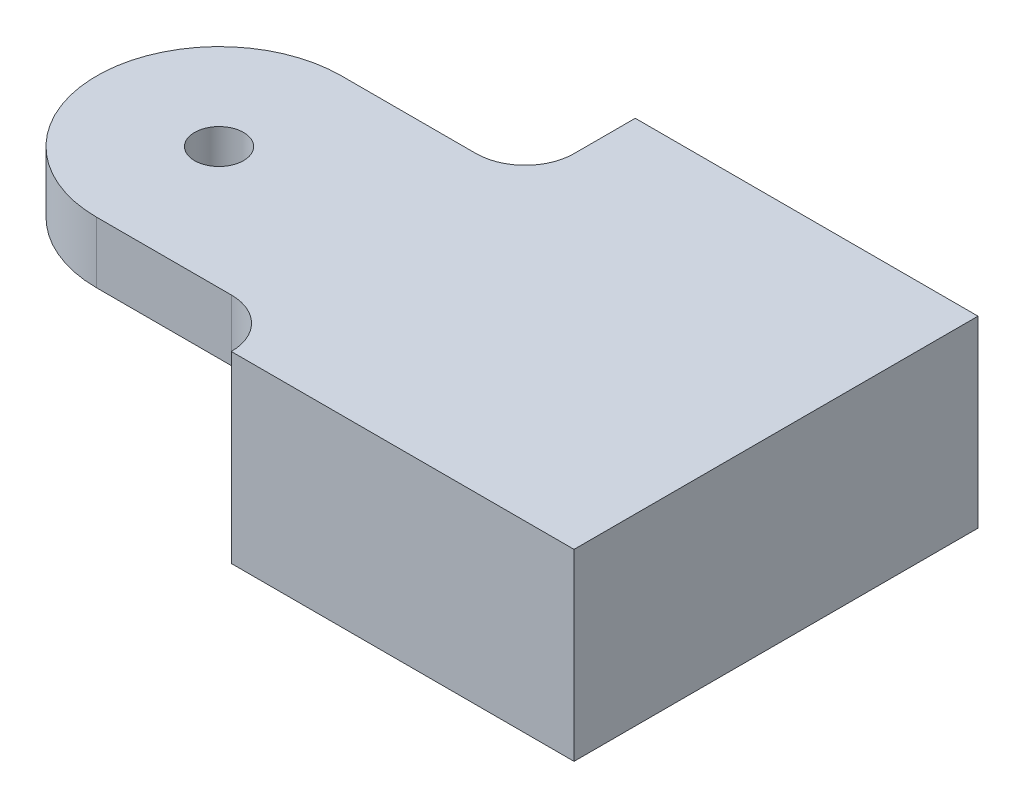
ISO-10303-21;
HEADER;
FILE_DESCRIPTION(('STEP AP214'),'2;1');
FILE_NAME('part.step','',(''),(''),'','','');
FILE_SCHEMA(('AUTOMOTIVE_DESIGN { 1 0 10303 214 1 1 1 1 }'));
ENDSEC;
DATA;
#1=APPLICATION_CONTEXT('core data for automotive mechanical design processes');
#2=APPLICATION_PROTOCOL_DEFINITION('international standard','automotive_design',2000,#1);
#3=PRODUCT_CONTEXT('',#1,'mechanical');
#4=PRODUCT('Part','Part','',(#3));
#5=PRODUCT_RELATED_PRODUCT_CATEGORY('part','',(#4));
#6=PRODUCT_DEFINITION_FORMATION('','',#4);
#7=PRODUCT_DEFINITION_CONTEXT('part definition',#1,'design');
#8=PRODUCT_DEFINITION('design','',#6,#7);
#9=PRODUCT_DEFINITION_SHAPE('','',#8);
#10=(LENGTH_UNIT() NAMED_UNIT(*) SI_UNIT(.MILLI.,.METRE.));
#11=(NAMED_UNIT(*) PLANE_ANGLE_UNIT() SI_UNIT($,.RADIAN.));
#12=(NAMED_UNIT(*) SI_UNIT($,.STERADIAN.) SOLID_ANGLE_UNIT());
#13=UNCERTAINTY_MEASURE_WITH_UNIT(LENGTH_MEASURE(1.E-05),#10,'distance_accuracy_value','');
#14=(GEOMETRIC_REPRESENTATION_CONTEXT(3) GLOBAL_UNCERTAINTY_ASSIGNED_CONTEXT((#13)) GLOBAL_UNIT_ASSIGNED_CONTEXT((#10,
#11,#12)) REPRESENTATION_CONTEXT('',''));
#15=CARTESIAN_POINT('',(0.,0.,0.));
#16=DIRECTION('',(0.,0.,1.));
#17=DIRECTION('',(1.,0.,0.));
#18=AXIS2_PLACEMENT_3D('',#15,#16,#17);
#19=CARTESIAN_POINT('',(0.,0.,0.));
#20=DIRECTION('',(0.,1.,0.));
#21=DIRECTION('',(0.,0.,1.));
#22=AXIS2_PLACEMENT_3D('',#19,#20,#21);
#23=PLANE('',#22);
#24=CARTESIAN_POINT('',(-43.,0.,-14.));
#25=DIRECTION('',(0.,1.,0.));
#26=DIRECTION('',(0.,0.,1.));
#27=AXIS2_PLACEMENT_3D('',#24,#25,#26);
#28=CIRCLE('',#27,2.);
#29=CARTESIAN_POINT('',(-43.,0.,-12.));
#30=VERTEX_POINT('',#29);
#31=EDGE_CURVE('E147',#30,#30,#28,.T.);
#32=ORIENTED_EDGE('',*,*,#31,.T.);
#33=EDGE_LOOP('',(#32));
#34=FACE_BOUND('',#33,.T.);
#35=DIRECTION('',(0.,0.,-1.));
#36=VECTOR('',#35,1.);
#37=CARTESIAN_POINT('',(-28.,0.,-33.));
#38=LINE('',#37,#36);
#39=CARTESIAN_POINT('',(-28.,0.,0.));
#40=VERTEX_POINT('',#39);
#41=CARTESIAN_POINT('',(-28.,0.,-28.));
#42=VERTEX_POINT('',#41);
#43=EDGE_CURVE('E55',#40,#42,#38,.T.);
#44=ORIENTED_EDGE('',*,*,#43,.F.);
#45=CARTESIAN_POINT('',(-32.,0.,0.));
#46=DIRECTION('',(0.,1.,0.));
#47=DIRECTION('',(0.,0.,1.));
#48=AXIS2_PLACEMENT_3D('',#45,#46,#47);
#49=CIRCLE('',#48,4.);
#50=CARTESIAN_POINT('',(-32.,0.,-4.));
#51=VERTEX_POINT('',#50);
#52=EDGE_CURVE('E212',#40,#51,#49,.T.);
#53=ORIENTED_EDGE('',*,*,#52,.T.);
#54=DIRECTION('',(1.,0.,0.));
#55=VECTOR('',#54,1.);
#56=CARTESIAN_POINT('',(0.,0.,-4.));
#57=LINE('',#56,#55);
#58=CARTESIAN_POINT('',(-43.,0.,-4.));
#59=VERTEX_POINT('',#58);
#60=EDGE_CURVE('E157',#59,#51,#57,.T.);
#61=ORIENTED_EDGE('',*,*,#60,.F.);
#62=CARTESIAN_POINT('',(-43.,0.,-14.));
#63=DIRECTION('',(0.,1.,0.));
#64=DIRECTION('',(0.,0.,1.));
#65=AXIS2_PLACEMENT_3D('',#62,#63,#64);
#66=CIRCLE('',#65,10.);
#67=CARTESIAN_POINT('',(-43.,0.,-24.));
#68=VERTEX_POINT('',#67);
#69=EDGE_CURVE('E188',#68,#59,#66,.T.);
#70=ORIENTED_EDGE('',*,*,#69,.F.);
#71=DIRECTION('',(1.,0.,0.));
#72=VECTOR('',#71,1.);
#73=CARTESIAN_POINT('',(0.,0.,-24.));
#74=LINE('',#73,#72);
#75=CARTESIAN_POINT('',(-32.,0.,-24.));
#76=VERTEX_POINT('',#75);
#77=EDGE_CURVE('E184',#68,#76,#74,.T.);
#78=ORIENTED_EDGE('',*,*,#77,.T.);
#79=CARTESIAN_POINT('',(-32.,0.,-28.));
#80=DIRECTION('',(0.,1.,0.));
#81=DIRECTION('',(0.,0.,1.));
#82=AXIS2_PLACEMENT_3D('',#79,#80,#81);
#83=CIRCLE('',#82,4.);
#84=EDGE_CURVE('E48',#76,#42,#83,.T.);
#85=ORIENTED_EDGE('',*,*,#84,.T.);
#86=EDGE_LOOP('',(#44,#53,#61,#70,#78,#85));
#87=FACE_BOUND('',#86,.T.);
#88=ADVANCED_FACE('F39',(#34,#87),#23,.F.);
#89=CARTESIAN_POINT('',(0.,5.,-24.));
#90=DIRECTION('',(0.,0.,-1.));
#91=DIRECTION('',(-1.,0.,0.));
#92=AXIS2_PLACEMENT_3D('',#89,#90,#91);
#93=PLANE('',#92);
#94=DIRECTION('',(1.,0.,0.));
#95=VECTOR('',#94,1.);
#96=CARTESIAN_POINT('',(0.,5.,-24.));
#97=LINE('',#96,#95);
#98=CARTESIAN_POINT('',(-43.,5.,-24.));
#99=VERTEX_POINT('',#98);
#100=CARTESIAN_POINT('',(-32.,5.,-24.));
#101=VERTEX_POINT('',#100);
#102=EDGE_CURVE('E156',#99,#101,#97,.T.);
#103=ORIENTED_EDGE('',*,*,#102,.T.);
#104=DIRECTION('',(0.,-1.,0.));
#105=VECTOR('',#104,1.);
#106=CARTESIAN_POINT('',(-32.,0.,-24.));
#107=LINE('',#106,#105);
#108=EDGE_CURVE('E218',#101,#76,#107,.T.);
#109=ORIENTED_EDGE('',*,*,#108,.T.);
#110=ORIENTED_EDGE('',*,*,#77,.F.);
#111=DIRECTION('',(0.,-1.,0.));
#112=VECTOR('',#111,1.);
#113=CARTESIAN_POINT('',(-43.,5.,-24.));
#114=LINE('',#113,#112);
#115=EDGE_CURVE('E151',#99,#68,#114,.T.);
#116=ORIENTED_EDGE('',*,*,#115,.F.);
#117=EDGE_LOOP('',(#103,#109,#110,#116));
#118=FACE_BOUND('',#117,.T.);
#119=ADVANCED_FACE('F235',(#118),#93,.T.);
#120=CARTESIAN_POINT('',(-43.,5.,-14.));
#121=DIRECTION('',(0.,-1.,0.));
#122=DIRECTION('',(0.,0.,-1.));
#123=AXIS2_PLACEMENT_3D('',#120,#121,#122);
#124=CYLINDRICAL_SURFACE('',#123,10.);
#125=ORIENTED_EDGE('',*,*,#69,.T.);
#126=DIRECTION('',(0.,-1.,0.));
#127=VECTOR('',#126,1.);
#128=CARTESIAN_POINT('',(-43.,5.,-4.));
#129=LINE('',#128,#127);
#130=CARTESIAN_POINT('',(-43.,5.,-4.));
#131=VERTEX_POINT('',#130);
#132=EDGE_CURVE('E204',#131,#59,#129,.T.);
#133=ORIENTED_EDGE('',*,*,#132,.F.);
#134=CARTESIAN_POINT('',(-43.,5.,-14.));
#135=DIRECTION('',(0.,1.,0.));
#136=DIRECTION('',(0.,0.,1.));
#137=AXIS2_PLACEMENT_3D('',#134,#135,#136);
#138=CIRCLE('',#137,10.);
#139=EDGE_CURVE('E161',#99,#131,#138,.T.);
#140=ORIENTED_EDGE('',*,*,#139,.F.);
#141=ORIENTED_EDGE('',*,*,#115,.T.);
#142=EDGE_LOOP('',(#125,#133,#140,#141));
#143=FACE_BOUND('',#142,.T.);
#144=ADVANCED_FACE('F239',(#143),#124,.T.);
#145=CARTESIAN_POINT('',(0.,5.,-4.));
#146=DIRECTION('',(0.,0.,-1.));
#147=DIRECTION('',(-1.,0.,0.));
#148=AXIS2_PLACEMENT_3D('',#145,#146,#147);
#149=PLANE('',#148);
#150=ORIENTED_EDGE('',*,*,#60,.T.);
#151=DIRECTION('',(0.,-1.,0.));
#152=VECTOR('',#151,1.);
#153=CARTESIAN_POINT('',(-32.,5.,-4.));
#154=LINE('',#153,#152);
#155=CARTESIAN_POINT('',(-32.,5.,-4.));
#156=VERTEX_POINT('',#155);
#157=EDGE_CURVE('E150',#51,#156,#154,.F.);
#158=ORIENTED_EDGE('',*,*,#157,.T.);
#159=DIRECTION('',(1.,0.,0.));
#160=VECTOR('',#159,1.);
#161=CARTESIAN_POINT('',(0.,5.,-4.));
#162=LINE('',#161,#160);
#163=EDGE_CURVE('E165',#131,#156,#162,.T.);
#164=ORIENTED_EDGE('',*,*,#163,.F.);
#165=ORIENTED_EDGE('',*,*,#132,.T.);
#166=EDGE_LOOP('',(#150,#158,#164,#165));
#167=FACE_BOUND('',#166,.T.);
#168=ADVANCED_FACE('F281',(#167),#149,.F.);
#169=CARTESIAN_POINT('',(0.,5.,0.));
#170=DIRECTION('',(0.,0.,-1.));
#171=DIRECTION('',(-1.,0.,0.));
#172=AXIS2_PLACEMENT_3D('',#169,#170,#171);
#173=PLANE('',#172);
#174=DIRECTION('',(0.,-1.,0.));
#175=VECTOR('',#174,1.);
#176=CARTESIAN_POINT('',(-28.,5.,0.));
#177=LINE('',#176,#175);
#178=CARTESIAN_POINT('',(-28.,5.,0.));
#179=VERTEX_POINT('',#178);
#180=EDGE_CURVE('E200',#179,#40,#177,.T.);
#181=ORIENTED_EDGE('',*,*,#180,.T.);
#182=CARTESIAN_POINT('',(-28.,-10.,0.));
#183=VERTEX_POINT('',#182);
#184=EDGE_CURVE('E199',#40,#183,#177,.T.);
#185=ORIENTED_EDGE('',*,*,#184,.T.);
#186=DIRECTION('',(-1.,0.,0.));
#187=VECTOR('',#186,1.);
#188=CARTESIAN_POINT('',(-28.,-10.,0.));
#189=LINE('',#188,#187);
#190=CARTESIAN_POINT('',(0.,-10.,0.));
#191=VERTEX_POINT('',#190);
#192=EDGE_CURVE('E134',#191,#183,#189,.T.);
#193=ORIENTED_EDGE('',*,*,#192,.F.);
#194=DIRECTION('',(0.,-1.,0.));
#195=VECTOR('',#194,1.);
#196=CARTESIAN_POINT('',(0.,5.,0.));
#197=LINE('',#196,#195);
#198=CARTESIAN_POINT('',(0.,5.,0.));
#199=VERTEX_POINT('',#198);
#200=EDGE_CURVE('E123',#199,#191,#197,.T.);
#201=ORIENTED_EDGE('',*,*,#200,.F.);
#202=DIRECTION('',(1.,0.,0.));
#203=VECTOR('',#202,1.);
#204=CARTESIAN_POINT('',(0.,5.,0.));
#205=LINE('',#204,#203);
#206=EDGE_CURVE('E169',#179,#199,#205,.T.);
#207=ORIENTED_EDGE('',*,*,#206,.F.);
#208=EDGE_LOOP('',(#181,#185,#193,#201,#207));
#209=FACE_BOUND('',#208,.T.);
#210=ADVANCED_FACE('F248',(#209),#173,.F.);
#211=CARTESIAN_POINT('',(0.,5.,0.));
#212=DIRECTION('',(-1.,0.,0.));
#213=DIRECTION('',(0.,0.,1.));
#214=AXIS2_PLACEMENT_3D('',#211,#212,#213);
#215=PLANE('',#214);
#216=ORIENTED_EDGE('',*,*,#200,.T.);
#217=DIRECTION('',(0.,0.,1.));
#218=VECTOR('',#217,1.);
#219=CARTESIAN_POINT('',(0.,-10.,0.));
#220=LINE('',#219,#218);
#221=CARTESIAN_POINT('',(0.,-10.,-33.));
#222=VERTEX_POINT('',#221);
#223=EDGE_CURVE('E127',#222,#191,#220,.T.);
#224=ORIENTED_EDGE('',*,*,#223,.F.);
#225=DIRECTION('',(0.,-1.,0.));
#226=VECTOR('',#225,1.);
#227=CARTESIAN_POINT('',(0.,5.,-33.));
#228=LINE('',#227,#226);
#229=CARTESIAN_POINT('',(0.,5.,-33.));
#230=VERTEX_POINT('',#229);
#231=EDGE_CURVE('E113',#230,#222,#228,.T.);
#232=ORIENTED_EDGE('',*,*,#231,.F.);
#233=DIRECTION('',(0.,0.,-1.));
#234=VECTOR('',#233,1.);
#235=CARTESIAN_POINT('',(0.,5.,0.));
#236=LINE('',#235,#234);
#237=EDGE_CURVE('E173',#199,#230,#236,.T.);
#238=ORIENTED_EDGE('',*,*,#237,.F.);
#239=EDGE_LOOP('',(#216,#224,#232,#238));
#240=FACE_BOUND('',#239,.T.);
#241=ADVANCED_FACE('F128',(#240),#215,.F.);
#242=CARTESIAN_POINT('',(0.,5.,-33.));
#243=DIRECTION('',(0.,0.,-1.));
#244=DIRECTION('',(-1.,0.,0.));
#245=AXIS2_PLACEMENT_3D('',#242,#243,#244);
#246=PLANE('',#245);
#247=ORIENTED_EDGE('',*,*,#231,.T.);
#248=DIRECTION('',(1.,0.,0.));
#249=VECTOR('',#248,1.);
#250=CARTESIAN_POINT('',(0.,-10.,-33.));
#251=LINE('',#250,#249);
#252=CARTESIAN_POINT('',(-28.,-10.,-33.));
#253=VERTEX_POINT('',#252);
#254=EDGE_CURVE('E118',#253,#222,#251,.T.);
#255=ORIENTED_EDGE('',*,*,#254,.F.);
#256=DIRECTION('',(0.,-1.,0.));
#257=VECTOR('',#256,1.);
#258=CARTESIAN_POINT('',(-28.,5.,-33.));
#259=LINE('',#258,#257);
#260=CARTESIAN_POINT('',(-28.,5.,-33.));
#261=VERTEX_POINT('',#260);
#262=EDGE_CURVE('E124',#261,#253,#259,.T.);
#263=ORIENTED_EDGE('',*,*,#262,.F.);
#264=DIRECTION('',(1.,0.,0.));
#265=VECTOR('',#264,1.);
#266=CARTESIAN_POINT('',(0.,5.,-33.));
#267=LINE('',#266,#265);
#268=EDGE_CURVE('E120',#261,#230,#267,.T.);
#269=ORIENTED_EDGE('',*,*,#268,.T.);
#270=EDGE_LOOP('',(#247,#255,#263,#269));
#271=FACE_BOUND('',#270,.T.);
#272=ADVANCED_FACE('F115',(#271),#246,.T.);
#273=CARTESIAN_POINT('',(-43.,5.,-14.));
#274=DIRECTION('',(0.,-1.,0.));
#275=DIRECTION('',(0.,0.,-1.));
#276=AXIS2_PLACEMENT_3D('',#273,#274,#275);
#277=CYLINDRICAL_SURFACE('',#276,2.);
#278=CARTESIAN_POINT('',(-43.,5.,-14.));
#279=DIRECTION('',(0.,1.,0.));
#280=DIRECTION('',(0.,0.,1.));
#281=AXIS2_PLACEMENT_3D('',#278,#279,#280);
#282=CIRCLE('',#281,2.);
#283=CARTESIAN_POINT('',(-43.,5.,-12.));
#284=VERTEX_POINT('',#283);
#285=EDGE_CURVE('E152',#284,#284,#282,.T.);
#286=ORIENTED_EDGE('',*,*,#285,.T.);
#287=EDGE_LOOP('',(#286));
#288=FACE_BOUND('',#287,.T.);
#289=ORIENTED_EDGE('',*,*,#31,.F.);
#290=EDGE_LOOP('',(#289));
#291=FACE_BOUND('',#290,.T.);
#292=ADVANCED_FACE('F252',(#288,#291),#277,.F.);
#293=CARTESIAN_POINT('',(-28.,5.,0.));
#294=DIRECTION('',(-1.,0.,0.));
#295=DIRECTION('',(0.,0.,1.));
#296=AXIS2_PLACEMENT_3D('',#293,#294,#295);
#297=PLANE('',#296);
#298=ORIENTED_EDGE('',*,*,#43,.T.);
#299=DIRECTION('',(0.,-1.,0.));
#300=VECTOR('',#299,1.);
#301=CARTESIAN_POINT('',(-28.,5.,-28.));
#302=LINE('',#301,#300);
#303=CARTESIAN_POINT('',(-28.,5.,-28.));
#304=VERTEX_POINT('',#303);
#305=EDGE_CURVE('E60',#42,#304,#302,.F.);
#306=ORIENTED_EDGE('',*,*,#305,.T.);
#307=DIRECTION('',(0.,0.,-1.));
#308=VECTOR('',#307,1.);
#309=CARTESIAN_POINT('',(-28.,5.,0.));
#310=LINE('',#309,#308);
#311=EDGE_CURVE('E178',#304,#261,#310,.T.);
#312=ORIENTED_EDGE('',*,*,#311,.T.);
#313=ORIENTED_EDGE('',*,*,#262,.T.);
#314=DIRECTION('',(0.,0.,-1.));
#315=VECTOR('',#314,1.);
#316=CARTESIAN_POINT('',(-28.,-10.,-33.));
#317=LINE('',#316,#315);
#318=EDGE_CURVE('E139',#183,#253,#317,.T.);
#319=ORIENTED_EDGE('',*,*,#318,.F.);
#320=ORIENTED_EDGE('',*,*,#184,.F.);
#321=EDGE_LOOP('',(#298,#306,#312,#313,#319,#320));
#322=FACE_BOUND('',#321,.T.);
#323=ADVANCED_FACE('F249',(#322),#297,.T.);
#324=CARTESIAN_POINT('',(0.,5.,0.));
#325=DIRECTION('',(0.,1.,0.));
#326=DIRECTION('',(0.,0.,1.));
#327=AXIS2_PLACEMENT_3D('',#324,#325,#326);
#328=PLANE('',#327);
#329=ORIENTED_EDGE('',*,*,#285,.F.);
#330=EDGE_LOOP('',(#329));
#331=FACE_BOUND('',#330,.T.);
#332=ORIENTED_EDGE('',*,*,#102,.F.);
#333=ORIENTED_EDGE('',*,*,#139,.T.);
#334=ORIENTED_EDGE('',*,*,#163,.T.);
#335=CARTESIAN_POINT('',(-32.,5.,0.));
#336=DIRECTION('',(0.,1.,0.));
#337=DIRECTION('',(0.,0.,1.));
#338=AXIS2_PLACEMENT_3D('',#335,#336,#337);
#339=CIRCLE('',#338,4.);
#340=EDGE_CURVE('E215',#156,#179,#339,.F.);
#341=ORIENTED_EDGE('',*,*,#340,.T.);
#342=ORIENTED_EDGE('',*,*,#206,.T.);
#343=ORIENTED_EDGE('',*,*,#237,.T.);
#344=ORIENTED_EDGE('',*,*,#268,.F.);
#345=ORIENTED_EDGE('',*,*,#311,.F.);
#346=CARTESIAN_POINT('',(-32.,5.,-28.));
#347=DIRECTION('',(0.,1.,0.));
#348=DIRECTION('',(0.,0.,1.));
#349=AXIS2_PLACEMENT_3D('',#346,#347,#348);
#350=CIRCLE('',#349,4.);
#351=EDGE_CURVE('E11',#304,#101,#350,.F.);
#352=ORIENTED_EDGE('',*,*,#351,.T.);
#353=EDGE_LOOP('',(#332,#333,#334,#341,#342,#343,#344,#345,#352));
#354=FACE_BOUND('',#353,.T.);
#355=ADVANCED_FACE('F233',(#331,#354),#328,.T.);
#356=CARTESIAN_POINT('',(0.,-10.,0.));
#357=DIRECTION('',(0.,1.,0.));
#358=DIRECTION('',(0.,0.,1.));
#359=AXIS2_PLACEMENT_3D('',#356,#357,#358);
#360=PLANE('',#359);
#361=ORIENTED_EDGE('',*,*,#254,.T.);
#362=ORIENTED_EDGE('',*,*,#223,.T.);
#363=ORIENTED_EDGE('',*,*,#192,.T.);
#364=ORIENTED_EDGE('',*,*,#318,.T.);
#365=EDGE_LOOP('',(#361,#362,#363,#364));
#366=FACE_BOUND('',#365,.T.);
#367=ADVANCED_FACE('F137',(#366),#360,.F.);
#368=CARTESIAN_POINT('',(-32.,5.,0.));
#369=DIRECTION('',(0.,-1.,0.));
#370=DIRECTION('',(0.,0.,-1.));
#371=AXIS2_PLACEMENT_3D('',#368,#369,#370);
#372=CYLINDRICAL_SURFACE('',#371,4.);
#373=ORIENTED_EDGE('',*,*,#340,.F.);
#374=ORIENTED_EDGE('',*,*,#157,.F.);
#375=ORIENTED_EDGE('',*,*,#52,.F.);
#376=ORIENTED_EDGE('',*,*,#180,.F.);
#377=EDGE_LOOP('',(#373,#374,#375,#376));
#378=FACE_BOUND('',#377,.T.);
#379=ADVANCED_FACE('F246',(#378),#372,.F.);
#380=CARTESIAN_POINT('',(-32.,5.,-28.));
#381=DIRECTION('',(0.,1.,0.));
#382=DIRECTION('',(0.,0.,1.));
#383=AXIS2_PLACEMENT_3D('',#380,#381,#382);
#384=CYLINDRICAL_SURFACE('',#383,4.);
#385=ORIENTED_EDGE('',*,*,#351,.F.);
#386=ORIENTED_EDGE('',*,*,#305,.F.);
#387=ORIENTED_EDGE('',*,*,#84,.F.);
#388=ORIENTED_EDGE('',*,*,#108,.F.);
#389=EDGE_LOOP('',(#385,#386,#387,#388));
#390=FACE_BOUND('',#389,.T.);
#391=ADVANCED_FACE('F41',(#390),#384,.F.);
#392=CLOSED_SHELL('',(#88,#119,#144,#168,#210,#241,#272,#292,#323,#355,#367,#379,#391));
#393=MANIFOLD_SOLID_BREP('B2',#392);
#394=ADVANCED_BREP_SHAPE_REPRESENTATION('',(#18,#393),#14);
#395=SHAPE_DEFINITION_REPRESENTATION(#9,#394);
ENDSEC;
END-ISO-10303-21;
